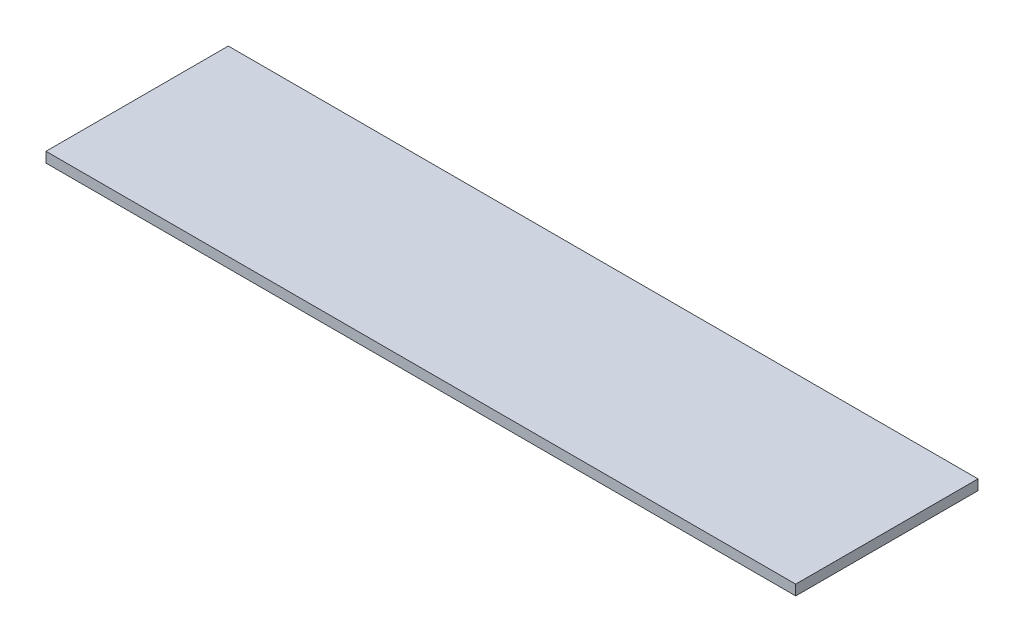
ISO-10303-21;
HEADER;
FILE_DESCRIPTION(('STEP AP214'),'2;1');
FILE_NAME('part.step','',(''),(''),'','','');
FILE_SCHEMA(('AUTOMOTIVE_DESIGN { 1 0 10303 214 1 1 1 1 }'));
ENDSEC;
DATA;
#1=APPLICATION_CONTEXT('core data for automotive mechanical design processes');
#2=APPLICATION_PROTOCOL_DEFINITION('international standard','automotive_design',2000,#1);
#3=PRODUCT_CONTEXT('',#1,'mechanical');
#4=PRODUCT('Part','Part','',(#3));
#5=PRODUCT_RELATED_PRODUCT_CATEGORY('part','',(#4));
#6=PRODUCT_DEFINITION_FORMATION('','',#4);
#7=PRODUCT_DEFINITION_CONTEXT('part definition',#1,'design');
#8=PRODUCT_DEFINITION('design','',#6,#7);
#9=PRODUCT_DEFINITION_SHAPE('','',#8);
#10=(LENGTH_UNIT() NAMED_UNIT(*) SI_UNIT(.MILLI.,.METRE.));
#11=(NAMED_UNIT(*) PLANE_ANGLE_UNIT() SI_UNIT($,.RADIAN.));
#12=(NAMED_UNIT(*) SI_UNIT($,.STERADIAN.) SOLID_ANGLE_UNIT());
#13=UNCERTAINTY_MEASURE_WITH_UNIT(LENGTH_MEASURE(1.E-05),#10,'distance_accuracy_value','');
#14=(GEOMETRIC_REPRESENTATION_CONTEXT(3) GLOBAL_UNCERTAINTY_ASSIGNED_CONTEXT((#13)) GLOBAL_UNIT_ASSIGNED_CONTEXT((#10,
#11,#12)) REPRESENTATION_CONTEXT('',''));
#15=CARTESIAN_POINT('',(0.,0.,0.));
#16=DIRECTION('',(0.,0.,1.));
#17=DIRECTION('',(1.,0.,0.));
#18=AXIS2_PLACEMENT_3D('',#15,#16,#17);
#19=CARTESIAN_POINT('',(-80.4269346912158,-6.35,-71.6216479123061));
#20=DIRECTION('',(-1.,0.,0.));
#21=DIRECTION('',(0.,0.,1.));
#22=AXIS2_PLACEMENT_3D('',#19,#20,#21);
#23=PLANE('',#22);
#24=DIRECTION('',(0.,0.,1.));
#25=VECTOR('',#24,1.);
#26=CARTESIAN_POINT('',(-80.4269346912158,0.,-71.6216479123061));
#27=LINE('',#26,#25);
#28=CARTESIAN_POINT('',(-80.4269346912158,0.,-71.6216479123061));
#29=VERTEX_POINT('',#28);
#30=CARTESIAN_POINT('',(-80.4269346912158,0.,41.0908520876939));
#31=VERTEX_POINT('',#30);
#32=EDGE_CURVE('E96',#29,#31,#27,.T.);
#33=ORIENTED_EDGE('',*,*,#32,.F.);
#34=DIRECTION('',(0.,1.,0.));
#35=VECTOR('',#34,1.);
#36=CARTESIAN_POINT('',(-80.4269346912158,-6.35,-71.6216479123061));
#37=LINE('',#36,#35);
#38=CARTESIAN_POINT('',(-80.4269346912158,-6.35,-71.6216479123061));
#39=VERTEX_POINT('',#38);
#40=EDGE_CURVE('E11',#39,#29,#37,.T.);
#41=ORIENTED_EDGE('',*,*,#40,.F.);
#42=DIRECTION('',(0.,0.,1.));
#43=VECTOR('',#42,1.);
#44=CARTESIAN_POINT('',(-80.4269346912158,-6.35,-71.6216479123061));
#45=LINE('',#44,#43);
#46=CARTESIAN_POINT('',(-80.4269346912158,-6.35,41.0908520876939));
#47=VERTEX_POINT('',#46);
#48=EDGE_CURVE('E90',#39,#47,#45,.T.);
#49=ORIENTED_EDGE('',*,*,#48,.T.);
#50=DIRECTION('',(0.,1.,0.));
#51=VECTOR('',#50,1.);
#52=CARTESIAN_POINT('',(-80.4269346912158,-6.35,41.0908520876939));
#53=LINE('',#52,#51);
#54=EDGE_CURVE('E35',#47,#31,#53,.T.);
#55=ORIENTED_EDGE('',*,*,#54,.T.);
#56=EDGE_LOOP('',(#33,#41,#49,#55));
#57=FACE_BOUND('',#56,.T.);
#58=ADVANCED_FACE('F32',(#57),#23,.T.);
#59=CARTESIAN_POINT('',(-80.4269346912158,-6.35,-71.6216479123061));
#60=DIRECTION('',(0.,0.,-1.));
#61=DIRECTION('',(-1.,0.,0.));
#62=AXIS2_PLACEMENT_3D('',#59,#60,#61);
#63=PLANE('',#62);
#64=DIRECTION('',(-1.,0.,0.));
#65=VECTOR('',#64,1.);
#66=CARTESIAN_POINT('',(-80.4269346912158,0.,-71.6216479123061));
#67=LINE('',#66,#65);
#68=CARTESIAN_POINT('',(383.123065308784,0.,-71.6216479123061));
#69=VERTEX_POINT('',#68);
#70=EDGE_CURVE('E92',#69,#29,#67,.T.);
#71=ORIENTED_EDGE('',*,*,#70,.F.);
#72=DIRECTION('',(0.,1.,0.));
#73=VECTOR('',#72,1.);
#74=CARTESIAN_POINT('',(383.123065308784,-6.35,-71.6216479123061));
#75=LINE('',#74,#73);
#76=CARTESIAN_POINT('',(383.123065308784,-6.35,-71.6216479123061));
#77=VERTEX_POINT('',#76);
#78=EDGE_CURVE('E41',#77,#69,#75,.T.);
#79=ORIENTED_EDGE('',*,*,#78,.F.);
#80=DIRECTION('',(-1.,0.,0.));
#81=VECTOR('',#80,1.);
#82=CARTESIAN_POINT('',(-80.4269346912158,-6.35,-71.6216479123061));
#83=LINE('',#82,#81);
#84=EDGE_CURVE('E87',#77,#39,#83,.T.);
#85=ORIENTED_EDGE('',*,*,#84,.T.);
#86=ORIENTED_EDGE('',*,*,#40,.T.);
#87=EDGE_LOOP('',(#71,#79,#85,#86));
#88=FACE_BOUND('',#87,.T.);
#89=ADVANCED_FACE('F106',(#88),#63,.T.);
#90=CARTESIAN_POINT('',(383.123065308784,-6.35,-71.6216479123061));
#91=DIRECTION('',(1.,0.,0.));
#92=DIRECTION('',(0.,0.,-1.));
#93=AXIS2_PLACEMENT_3D('',#90,#91,#92);
#94=PLANE('',#93);
#95=DIRECTION('',(0.,0.,-1.));
#96=VECTOR('',#95,1.);
#97=CARTESIAN_POINT('',(383.123065308784,0.,-71.6216479123061));
#98=LINE('',#97,#96);
#99=CARTESIAN_POINT('',(383.123065308784,0.,41.0908520876939));
#100=VERTEX_POINT('',#99);
#101=EDGE_CURVE('E82',#100,#69,#98,.T.);
#102=ORIENTED_EDGE('',*,*,#101,.F.);
#103=DIRECTION('',(0.,1.,0.));
#104=VECTOR('',#103,1.);
#105=CARTESIAN_POINT('',(383.123065308784,-6.35,41.0908520876939));
#106=LINE('',#105,#104);
#107=CARTESIAN_POINT('',(383.123065308784,-6.35,41.0908520876939));
#108=VERTEX_POINT('',#107);
#109=EDGE_CURVE('E77',#108,#100,#106,.T.);
#110=ORIENTED_EDGE('',*,*,#109,.F.);
#111=DIRECTION('',(0.,0.,-1.));
#112=VECTOR('',#111,1.);
#113=CARTESIAN_POINT('',(383.123065308784,-6.35,-71.6216479123061));
#114=LINE('',#113,#112);
#115=EDGE_CURVE('E80',#108,#77,#114,.T.);
#116=ORIENTED_EDGE('',*,*,#115,.T.);
#117=ORIENTED_EDGE('',*,*,#78,.T.);
#118=EDGE_LOOP('',(#102,#110,#116,#117));
#119=FACE_BOUND('',#118,.T.);
#120=ADVANCED_FACE('F79',(#119),#94,.T.);
#121=CARTESIAN_POINT('',(-80.4269346912158,-6.35,41.0908520876939));
#122=DIRECTION('',(0.,0.,1.));
#123=DIRECTION('',(1.,0.,0.));
#124=AXIS2_PLACEMENT_3D('',#121,#122,#123);
#125=PLANE('',#124);
#126=DIRECTION('',(1.,0.,0.));
#127=VECTOR('',#126,1.);
#128=CARTESIAN_POINT('',(-80.4269346912158,0.,41.0908520876939));
#129=LINE('',#128,#127);
#130=EDGE_CURVE('E99',#31,#100,#129,.T.);
#131=ORIENTED_EDGE('',*,*,#130,.F.);
#132=ORIENTED_EDGE('',*,*,#54,.F.);
#133=DIRECTION('',(1.,0.,0.));
#134=VECTOR('',#133,1.);
#135=CARTESIAN_POINT('',(-80.4269346912158,-6.35,41.0908520876939));
#136=LINE('',#135,#134);
#137=EDGE_CURVE('E86',#47,#108,#136,.T.);
#138=ORIENTED_EDGE('',*,*,#137,.T.);
#139=ORIENTED_EDGE('',*,*,#109,.T.);
#140=EDGE_LOOP('',(#131,#132,#138,#139));
#141=FACE_BOUND('',#140,.T.);
#142=ADVANCED_FACE('F89',(#141),#125,.T.);
#143=CARTESIAN_POINT('',(-80.4269346912158,-6.35,41.0908520876939));
#144=DIRECTION('',(0.,1.,0.));
#145=DIRECTION('',(0.,0.,1.));
#146=AXIS2_PLACEMENT_3D('',#143,#144,#145);
#147=PLANE('',#146);
#148=ORIENTED_EDGE('',*,*,#48,.F.);
#149=ORIENTED_EDGE('',*,*,#84,.F.);
#150=ORIENTED_EDGE('',*,*,#115,.F.);
#151=ORIENTED_EDGE('',*,*,#137,.F.);
#152=EDGE_LOOP('',(#148,#149,#150,#151));
#153=FACE_BOUND('',#152,.T.);
#154=ADVANCED_FACE('F85',(#153),#147,.F.);
#155=CARTESIAN_POINT('',(-80.4269346912158,0.,41.0908520876939));
#156=DIRECTION('',(0.,1.,0.));
#157=DIRECTION('',(0.,0.,1.));
#158=AXIS2_PLACEMENT_3D('',#155,#156,#157);
#159=PLANE('',#158);
#160=ORIENTED_EDGE('',*,*,#32,.T.);
#161=ORIENTED_EDGE('',*,*,#130,.T.);
#162=ORIENTED_EDGE('',*,*,#101,.T.);
#163=ORIENTED_EDGE('',*,*,#70,.T.);
#164=EDGE_LOOP('',(#160,#161,#162,#163));
#165=FACE_BOUND('',#164,.T.);
#166=ADVANCED_FACE('F105',(#165),#159,.T.);
#167=CLOSED_SHELL('',(#58,#89,#120,#142,#154,#166));
#168=MANIFOLD_SOLID_BREP('B2',#167);
#169=ADVANCED_BREP_SHAPE_REPRESENTATION('',(#18,#168),#14);
#170=SHAPE_DEFINITION_REPRESENTATION(#9,#169);
ENDSEC;
END-ISO-10303-21;
